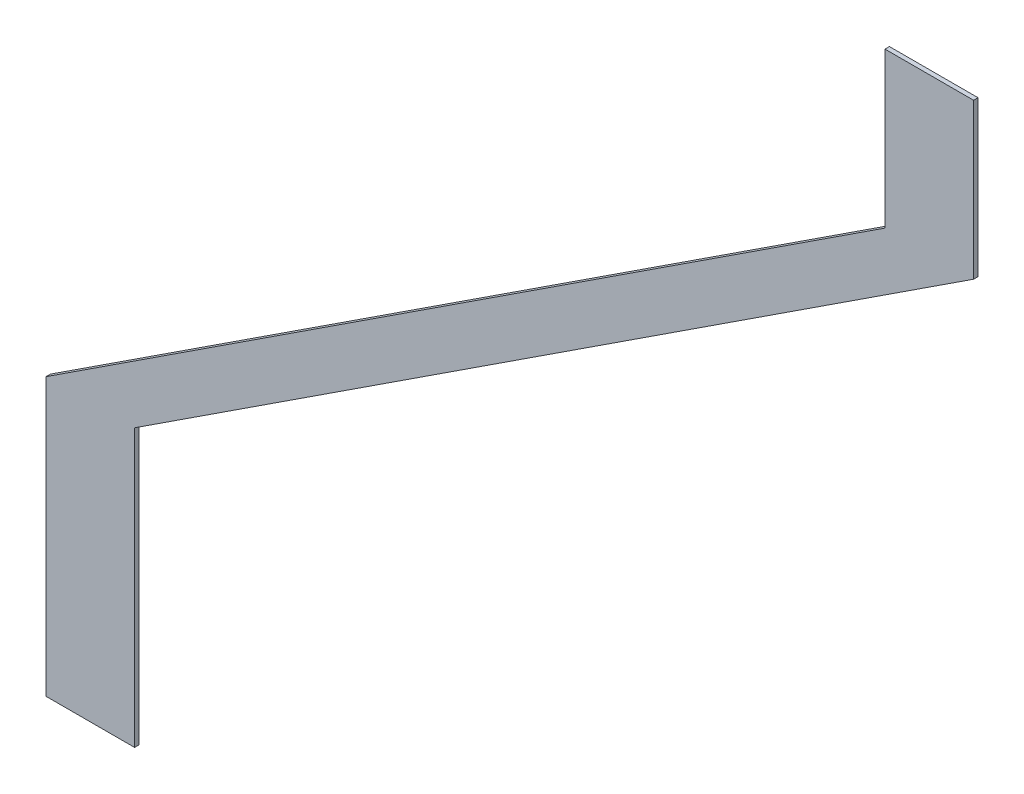
ISO-10303-21;
HEADER;
FILE_DESCRIPTION(('STEP AP214'),'2;1');
FILE_NAME('part.step','',(''),(''),'','','');
FILE_SCHEMA(('AUTOMOTIVE_DESIGN { 1 0 10303 214 1 1 1 1 }'));
ENDSEC;
DATA;
#1=APPLICATION_CONTEXT('core data for automotive mechanical design processes');
#2=APPLICATION_PROTOCOL_DEFINITION('international standard','automotive_design',2000,#1);
#3=PRODUCT_CONTEXT('',#1,'mechanical');
#4=PRODUCT('Part','Part','',(#3));
#5=PRODUCT_RELATED_PRODUCT_CATEGORY('part','',(#4));
#6=PRODUCT_DEFINITION_FORMATION('','',#4);
#7=PRODUCT_DEFINITION_CONTEXT('part definition',#1,'design');
#8=PRODUCT_DEFINITION('design','',#6,#7);
#9=PRODUCT_DEFINITION_SHAPE('','',#8);
#10=(LENGTH_UNIT() NAMED_UNIT(*) SI_UNIT(.MILLI.,.METRE.));
#11=(NAMED_UNIT(*) PLANE_ANGLE_UNIT() SI_UNIT($,.RADIAN.));
#12=(NAMED_UNIT(*) SI_UNIT($,.STERADIAN.) SOLID_ANGLE_UNIT());
#13=UNCERTAINTY_MEASURE_WITH_UNIT(LENGTH_MEASURE(1.E-05),#10,'distance_accuracy_value','');
#14=(GEOMETRIC_REPRESENTATION_CONTEXT(3) GLOBAL_UNCERTAINTY_ASSIGNED_CONTEXT((#13)) GLOBAL_UNIT_ASSIGNED_CONTEXT((#10,
#11,#12)) REPRESENTATION_CONTEXT('',''));
#15=CARTESIAN_POINT('',(0.,0.,0.));
#16=DIRECTION('',(0.,0.,1.));
#17=DIRECTION('',(1.,0.,0.));
#18=AXIS2_PLACEMENT_3D('',#15,#16,#17);
#19=CARTESIAN_POINT('',(-1072.35288999522,0.,-4.));
#20=DIRECTION('',(-1.,0.,0.));
#21=DIRECTION('',(0.,0.,1.));
#22=AXIS2_PLACEMENT_3D('',#19,#20,#21);
#23=PLANE('',#22);
#24=DIRECTION('',(0.,-1.,0.));
#25=VECTOR('',#24,1.);
#26=CARTESIAN_POINT('',(-1072.35288999522,0.,0.));
#27=LINE('',#26,#25);
#28=CARTESIAN_POINT('',(-1072.35288999522,140.,0.));
#29=VERTEX_POINT('',#28);
#30=CARTESIAN_POINT('',(-1072.35288999522,0.,0.));
#31=VERTEX_POINT('',#30);
#32=EDGE_CURVE('E133',#29,#31,#27,.T.);
#33=ORIENTED_EDGE('',*,*,#32,.F.);
#34=DIRECTION('',(0.,0.,1.));
#35=VECTOR('',#34,1.);
#36=CARTESIAN_POINT('',(-1072.35288999522,140.,-4.));
#37=LINE('',#36,#35);
#38=CARTESIAN_POINT('',(-1072.35288999522,140.,-4.));
#39=VERTEX_POINT('',#38);
#40=EDGE_CURVE('E11',#39,#29,#37,.T.);
#41=ORIENTED_EDGE('',*,*,#40,.F.);
#42=DIRECTION('',(0.,-1.,0.));
#43=VECTOR('',#42,1.);
#44=CARTESIAN_POINT('',(-1072.35288999522,0.,-4.));
#45=LINE('',#44,#43);
#46=CARTESIAN_POINT('',(-1072.35288999522,0.,-4.));
#47=VERTEX_POINT('',#46);
#48=EDGE_CURVE('E153',#39,#47,#45,.T.);
#49=ORIENTED_EDGE('',*,*,#48,.T.);
#50=DIRECTION('',(0.,0.,1.));
#51=VECTOR('',#50,1.);
#52=CARTESIAN_POINT('',(-1072.35288999522,0.,-4.));
#53=LINE('',#52,#51);
#54=EDGE_CURVE('E39',#47,#31,#53,.T.);
#55=ORIENTED_EDGE('',*,*,#54,.T.);
#56=EDGE_LOOP('',(#33,#41,#49,#55));
#57=FACE_BOUND('',#56,.T.);
#58=ADVANCED_FACE('F36',(#57),#23,.T.);
#59=CARTESIAN_POINT('',(-1072.35288999522,140.,-4.));
#60=DIRECTION('',(0.,1.,0.));
#61=DIRECTION('',(0.,0.,1.));
#62=AXIS2_PLACEMENT_3D('',#59,#60,#61);
#63=PLANE('',#62);
#64=DIRECTION('',(-1.,0.,0.));
#65=VECTOR('',#64,1.);
#66=CARTESIAN_POINT('',(-1072.35288999522,140.,0.));
#67=LINE('',#66,#65);
#68=CARTESIAN_POINT('',(-992.352889995217,140.,0.));
#69=VERTEX_POINT('',#68);
#70=EDGE_CURVE('E151',#69,#29,#67,.T.);
#71=ORIENTED_EDGE('',*,*,#70,.F.);
#72=DIRECTION('',(0.,0.,1.));
#73=VECTOR('',#72,1.);
#74=CARTESIAN_POINT('',(-992.352889995217,140.,-4.));
#75=LINE('',#74,#73);
#76=CARTESIAN_POINT('',(-992.352889995217,140.,-4.));
#77=VERTEX_POINT('',#76);
#78=EDGE_CURVE('E45',#77,#69,#75,.T.);
#79=ORIENTED_EDGE('',*,*,#78,.F.);
#80=DIRECTION('',(-1.,0.,0.));
#81=VECTOR('',#80,1.);
#82=CARTESIAN_POINT('',(-1072.35288999522,140.,-4.));
#83=LINE('',#82,#81);
#84=EDGE_CURVE('E123',#77,#39,#83,.T.);
#85=ORIENTED_EDGE('',*,*,#84,.T.);
#86=ORIENTED_EDGE('',*,*,#40,.T.);
#87=EDGE_LOOP('',(#71,#79,#85,#86));
#88=FACE_BOUND('',#87,.T.);
#89=ADVANCED_FACE('F165',(#88),#63,.T.);
#90=CARTESIAN_POINT('',(-992.352889995217,140.,-4.));
#91=DIRECTION('',(1.,0.,0.));
#92=DIRECTION('',(0.,0.,-1.));
#93=AXIS2_PLACEMENT_3D('',#90,#91,#92);
#94=PLANE('',#93);
#95=DIRECTION('',(0.,1.,0.));
#96=VECTOR('',#95,1.);
#97=CARTESIAN_POINT('',(-992.352889995217,140.,0.));
#98=LINE('',#97,#96);
#99=CARTESIAN_POINT('',(-992.352889995217,0.,0.));
#100=VERTEX_POINT('',#99);
#101=EDGE_CURVE('E110',#100,#69,#98,.T.);
#102=ORIENTED_EDGE('',*,*,#101,.F.);
#103=DIRECTION('',(0.,0.,1.));
#104=VECTOR('',#103,1.);
#105=CARTESIAN_POINT('',(-992.352889995217,0.,-4.));
#106=LINE('',#105,#104);
#107=CARTESIAN_POINT('',(-992.352889995217,0.,-4.));
#108=VERTEX_POINT('',#107);
#109=EDGE_CURVE('E105',#108,#100,#106,.T.);
#110=ORIENTED_EDGE('',*,*,#109,.F.);
#111=DIRECTION('',(0.,1.,0.));
#112=VECTOR('',#111,1.);
#113=CARTESIAN_POINT('',(-992.352889995217,140.,-4.));
#114=LINE('',#113,#112);
#115=EDGE_CURVE('E108',#108,#77,#114,.T.);
#116=ORIENTED_EDGE('',*,*,#115,.T.);
#117=ORIENTED_EDGE('',*,*,#78,.T.);
#118=EDGE_LOOP('',(#102,#110,#116,#117));
#119=FACE_BOUND('',#118,.T.);
#120=ADVANCED_FACE('F107',(#119),#94,.T.);
#121=CARTESIAN_POINT('',(-1750.,-495.,-4.));
#122=DIRECTION('',(0.546951594986809,-0.837164232836894,0.));
#123=DIRECTION('',(0.837164232836894,0.546951594986809,0.));
#124=AXIS2_PLACEMENT_3D('',#121,#122,#123);
#125=PLANE('',#124);
#126=DIRECTION('',(0.837164232836894,0.546951594986809,0.));
#127=VECTOR('',#126,1.);
#128=CARTESIAN_POINT('',(-1750.,-495.,0.));
#129=LINE('',#128,#127);
#130=CARTESIAN_POINT('',(-1750.,-495.,0.));
#131=VERTEX_POINT('',#130);
#132=EDGE_CURVE('E148',#131,#100,#129,.T.);
#133=ORIENTED_EDGE('',*,*,#132,.F.);
#134=DIRECTION('',(0.,0.,1.));
#135=VECTOR('',#134,1.);
#136=CARTESIAN_POINT('',(-1750.,-495.,-4.));
#137=LINE('',#136,#135);
#138=CARTESIAN_POINT('',(-1750.,-495.,-4.));
#139=VERTEX_POINT('',#138);
#140=EDGE_CURVE('E115',#139,#131,#137,.T.);
#141=ORIENTED_EDGE('',*,*,#140,.F.);
#142=DIRECTION('',(0.837164232836894,0.546951594986809,0.));
#143=VECTOR('',#142,1.);
#144=CARTESIAN_POINT('',(-1750.,-495.,-4.));
#145=LINE('',#144,#143);
#146=EDGE_CURVE('E121',#139,#108,#145,.T.);
#147=ORIENTED_EDGE('',*,*,#146,.T.);
#148=ORIENTED_EDGE('',*,*,#109,.T.);
#149=EDGE_LOOP('',(#133,#141,#147,#148));
#150=FACE_BOUND('',#149,.T.);
#151=ADVANCED_FACE('F125',(#150),#125,.T.);
#152=CARTESIAN_POINT('',(-1750.,-745.,-4.));
#153=DIRECTION('',(1.,0.,0.));
#154=DIRECTION('',(0.,0.,-1.));
#155=AXIS2_PLACEMENT_3D('',#152,#153,#154);
#156=PLANE('',#155);
#157=DIRECTION('',(0.,1.,0.));
#158=VECTOR('',#157,1.);
#159=CARTESIAN_POINT('',(-1750.,-745.,0.));
#160=LINE('',#159,#158);
#161=CARTESIAN_POINT('',(-1750.,-745.,0.));
#162=VERTEX_POINT('',#161);
#163=EDGE_CURVE('E145',#162,#131,#160,.T.);
#164=ORIENTED_EDGE('',*,*,#163,.F.);
#165=DIRECTION('',(0.,0.,1.));
#166=VECTOR('',#165,1.);
#167=CARTESIAN_POINT('',(-1750.,-745.,-4.));
#168=LINE('',#167,#166);
#169=CARTESIAN_POINT('',(-1750.,-745.,-4.));
#170=VERTEX_POINT('',#169);
#171=EDGE_CURVE('E157',#170,#162,#168,.T.);
#172=ORIENTED_EDGE('',*,*,#171,.F.);
#173=DIRECTION('',(0.,1.,0.));
#174=VECTOR('',#173,1.);
#175=CARTESIAN_POINT('',(-1750.,-745.,-4.));
#176=LINE('',#175,#174);
#177=EDGE_CURVE('E126',#170,#139,#176,.T.);
#178=ORIENTED_EDGE('',*,*,#177,.T.);
#179=ORIENTED_EDGE('',*,*,#140,.T.);
#180=EDGE_LOOP('',(#164,#172,#178,#179));
#181=FACE_BOUND('',#180,.T.);
#182=ADVANCED_FACE('F178',(#181),#156,.T.);
#183=CARTESIAN_POINT('',(-1830.,-745.,-4.));
#184=DIRECTION('',(0.,-1.,0.));
#185=DIRECTION('',(0.,0.,-1.));
#186=AXIS2_PLACEMENT_3D('',#183,#184,#185);
#187=PLANE('',#186);
#188=DIRECTION('',(1.,0.,0.));
#189=VECTOR('',#188,1.);
#190=CARTESIAN_POINT('',(-1830.,-745.,0.));
#191=LINE('',#190,#189);
#192=CARTESIAN_POINT('',(-1830.,-745.,0.));
#193=VERTEX_POINT('',#192);
#194=EDGE_CURVE('E142',#193,#162,#191,.T.);
#195=ORIENTED_EDGE('',*,*,#194,.F.);
#196=DIRECTION('',(0.,0.,1.));
#197=VECTOR('',#196,1.);
#198=CARTESIAN_POINT('',(-1830.,-745.,-4.));
#199=LINE('',#198,#197);
#200=CARTESIAN_POINT('',(-1830.,-745.,-4.));
#201=VERTEX_POINT('',#200);
#202=EDGE_CURVE('E159',#201,#193,#199,.T.);
#203=ORIENTED_EDGE('',*,*,#202,.F.);
#204=DIRECTION('',(1.,0.,0.));
#205=VECTOR('',#204,1.);
#206=CARTESIAN_POINT('',(-1830.,-745.,-4.));
#207=LINE('',#206,#205);
#208=EDGE_CURVE('E128',#201,#170,#207,.T.);
#209=ORIENTED_EDGE('',*,*,#208,.T.);
#210=ORIENTED_EDGE('',*,*,#171,.T.);
#211=EDGE_LOOP('',(#195,#203,#209,#210));
#212=FACE_BOUND('',#211,.T.);
#213=ADVANCED_FACE('F181',(#212),#187,.T.);
#214=CARTESIAN_POINT('',(-1830.,-495.,-4.));
#215=DIRECTION('',(-1.,0.,0.));
#216=DIRECTION('',(0.,0.,1.));
#217=AXIS2_PLACEMENT_3D('',#214,#215,#216);
#218=PLANE('',#217);
#219=DIRECTION('',(0.,-1.,0.));
#220=VECTOR('',#219,1.);
#221=CARTESIAN_POINT('',(-1830.,-495.,0.));
#222=LINE('',#221,#220);
#223=CARTESIAN_POINT('',(-1830.,-495.,0.));
#224=VERTEX_POINT('',#223);
#225=EDGE_CURVE('E139',#224,#193,#222,.T.);
#226=ORIENTED_EDGE('',*,*,#225,.F.);
#227=DIRECTION('',(0.,0.,1.));
#228=VECTOR('',#227,1.);
#229=CARTESIAN_POINT('',(-1830.,-495.,-4.));
#230=LINE('',#229,#228);
#231=CARTESIAN_POINT('',(-1830.,-495.,-4.));
#232=VERTEX_POINT('',#231);
#233=EDGE_CURVE('E160',#232,#224,#230,.T.);
#234=ORIENTED_EDGE('',*,*,#233,.F.);
#235=DIRECTION('',(0.,-1.,0.));
#236=VECTOR('',#235,1.);
#237=CARTESIAN_POINT('',(-1830.,-495.,-4.));
#238=LINE('',#237,#236);
#239=EDGE_CURVE('E276',#232,#201,#238,.T.);
#240=ORIENTED_EDGE('',*,*,#239,.T.);
#241=ORIENTED_EDGE('',*,*,#202,.T.);
#242=EDGE_LOOP('',(#226,#234,#240,#241));
#243=FACE_BOUND('',#242,.T.);
#244=ADVANCED_FACE('F185',(#243),#218,.T.);
#245=CARTESIAN_POINT('',(-1072.35288999522,0.,-4.));
#246=DIRECTION('',(-0.546951594986809,0.837164232836894,0.));
#247=DIRECTION('',(-0.837164232836894,-0.546951594986809,0.));
#248=AXIS2_PLACEMENT_3D('',#245,#246,#247);
#249=PLANE('',#248);
#250=DIRECTION('',(-0.837164232836894,-0.546951594986809,0.));
#251=VECTOR('',#250,1.);
#252=CARTESIAN_POINT('',(-1072.35288999522,0.,0.));
#253=LINE('',#252,#251);
#254=EDGE_CURVE('E136',#31,#224,#253,.T.);
#255=ORIENTED_EDGE('',*,*,#254,.F.);
#256=ORIENTED_EDGE('',*,*,#54,.F.);
#257=DIRECTION('',(-0.837164232836894,-0.546951594986809,0.));
#258=VECTOR('',#257,1.);
#259=CARTESIAN_POINT('',(-1072.35288999522,0.,-4.));
#260=LINE('',#259,#258);
#261=EDGE_CURVE('E277',#47,#232,#260,.T.);
#262=ORIENTED_EDGE('',*,*,#261,.T.);
#263=ORIENTED_EDGE('',*,*,#233,.T.);
#264=EDGE_LOOP('',(#255,#256,#262,#263));
#265=FACE_BOUND('',#264,.T.);
#266=ADVANCED_FACE('F162',(#265),#249,.T.);
#267=CARTESIAN_POINT('',(0.,0.,-4.));
#268=DIRECTION('',(0.,0.,-1.));
#269=DIRECTION('',(-1.,0.,0.));
#270=AXIS2_PLACEMENT_3D('',#267,#268,#269);
#271=PLANE('',#270);
#272=ORIENTED_EDGE('',*,*,#48,.F.);
#273=ORIENTED_EDGE('',*,*,#84,.F.);
#274=ORIENTED_EDGE('',*,*,#115,.F.);
#275=ORIENTED_EDGE('',*,*,#146,.F.);
#276=ORIENTED_EDGE('',*,*,#177,.F.);
#277=ORIENTED_EDGE('',*,*,#208,.F.);
#278=ORIENTED_EDGE('',*,*,#239,.F.);
#279=ORIENTED_EDGE('',*,*,#261,.F.);
#280=EDGE_LOOP('',(#272,#273,#274,#275,#276,#277,#278,#279));
#281=FACE_BOUND('',#280,.T.);
#282=ADVANCED_FACE('F119',(#281),#271,.T.);
#283=CARTESIAN_POINT('',(0.,0.,0.));
#284=DIRECTION('',(0.,0.,-1.));
#285=DIRECTION('',(-1.,0.,0.));
#286=AXIS2_PLACEMENT_3D('',#283,#284,#285);
#287=PLANE('',#286);
#288=ORIENTED_EDGE('',*,*,#32,.T.);
#289=ORIENTED_EDGE('',*,*,#254,.T.);
#290=ORIENTED_EDGE('',*,*,#225,.T.);
#291=ORIENTED_EDGE('',*,*,#194,.T.);
#292=ORIENTED_EDGE('',*,*,#163,.T.);
#293=ORIENTED_EDGE('',*,*,#132,.T.);
#294=ORIENTED_EDGE('',*,*,#101,.T.);
#295=ORIENTED_EDGE('',*,*,#70,.T.);
#296=EDGE_LOOP('',(#288,#289,#290,#291,#292,#293,#294,#295));
#297=FACE_BOUND('',#296,.T.);
#298=ADVANCED_FACE('F164',(#297),#287,.F.);
#299=CLOSED_SHELL('',(#58,#89,#120,#151,#182,#213,#244,#266,#282,#298));
#300=MANIFOLD_SOLID_BREP('B2',#299);
#301=ADVANCED_BREP_SHAPE_REPRESENTATION('',(#18,#300),#14);
#302=SHAPE_DEFINITION_REPRESENTATION(#9,#301);
ENDSEC;
END-ISO-10303-21;
